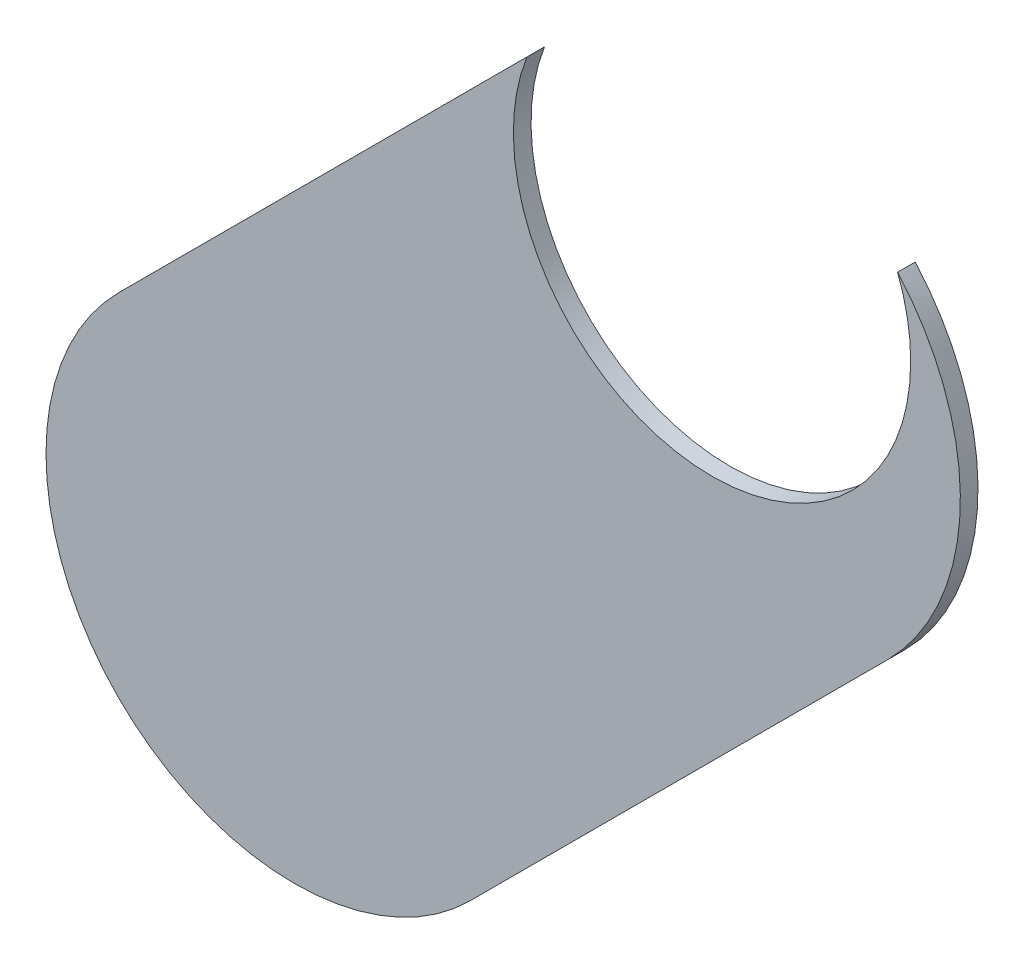
ISO-10303-21;
HEADER;
FILE_DESCRIPTION(('STEP AP214'),'2;1');
FILE_NAME('part.step','',(''),(''),'','','');
FILE_SCHEMA(('AUTOMOTIVE_DESIGN { 1 0 10303 214 1 1 1 1 }'));
ENDSEC;
DATA;
#1=APPLICATION_CONTEXT('core data for automotive mechanical design processes');
#2=APPLICATION_PROTOCOL_DEFINITION('international standard','automotive_design',2000,#1);
#3=PRODUCT_CONTEXT('',#1,'mechanical');
#4=PRODUCT('Part','Part','',(#3));
#5=PRODUCT_RELATED_PRODUCT_CATEGORY('part','',(#4));
#6=PRODUCT_DEFINITION_FORMATION('','',#4);
#7=PRODUCT_DEFINITION_CONTEXT('part definition',#1,'design');
#8=PRODUCT_DEFINITION('design','',#6,#7);
#9=PRODUCT_DEFINITION_SHAPE('','',#8);
#10=(LENGTH_UNIT() NAMED_UNIT(*) SI_UNIT(.MILLI.,.METRE.));
#11=(NAMED_UNIT(*) PLANE_ANGLE_UNIT() SI_UNIT($,.RADIAN.));
#12=(NAMED_UNIT(*) SI_UNIT($,.STERADIAN.) SOLID_ANGLE_UNIT());
#13=UNCERTAINTY_MEASURE_WITH_UNIT(LENGTH_MEASURE(1.E-05),#10,'distance_accuracy_value','');
#14=(GEOMETRIC_REPRESENTATION_CONTEXT(3) GLOBAL_UNCERTAINTY_ASSIGNED_CONTEXT((#13)) GLOBAL_UNIT_ASSIGNED_CONTEXT((#10,
#11,#12)) REPRESENTATION_CONTEXT('',''));
#15=CARTESIAN_POINT('',(0.,0.,0.));
#16=DIRECTION('',(0.,0.,1.));
#17=DIRECTION('',(1.,0.,0.));
#18=AXIS2_PLACEMENT_3D('',#15,#16,#17);
#19=CARTESIAN_POINT('',(56.93250996,61.21601168,0.));
#20=DIRECTION('',(-0.707106781186548,0.707106781186548,0.));
#21=DIRECTION('',(0.707106781186548,0.707106781186548,0.));
#22=AXIS2_PLACEMENT_3D('',#19,#20,#21);
#23=PLANE('',#22);
#24=DIRECTION('',(0.707106781186548,0.707106781186548,0.));
#25=VECTOR('',#24,1.);
#26=CARTESIAN_POINT('',(56.93250996,61.21601168,0.03556));
#27=LINE('',#26,#25);
#28=CARTESIAN_POINT('',(56.93250996,61.21601168,0.03556));
#29=VERTEX_POINT('',#28);
#30=CARTESIAN_POINT('',(57.77355476,62.05705648,0.03556));
#31=VERTEX_POINT('',#30);
#32=EDGE_CURVE('E11',#29,#31,#27,.T.);
#33=ORIENTED_EDGE('',*,*,#32,.F.);
#34=DIRECTION('',(0.,0.,1.));
#35=VECTOR('',#34,1.);
#36=CARTESIAN_POINT('',(56.93250996,61.21601168,0.));
#37=LINE('',#36,#35);
#38=CARTESIAN_POINT('',(56.93250996,61.21601168,0.));
#39=VERTEX_POINT('',#38);
#40=EDGE_CURVE('E24',#39,#29,#37,.T.);
#41=ORIENTED_EDGE('',*,*,#40,.F.);
#42=DIRECTION('',(0.707106781186548,0.707106781186548,0.));
#43=VECTOR('',#42,1.);
#44=CARTESIAN_POINT('',(56.93250996,61.21601168,0.));
#45=LINE('',#44,#43);
#46=CARTESIAN_POINT('',(57.77355476,62.05705648,0.));
#47=VERTEX_POINT('',#46);
#48=EDGE_CURVE('E88',#39,#47,#45,.T.);
#49=ORIENTED_EDGE('',*,*,#48,.T.);
#50=DIRECTION('',(0.,0.,1.));
#51=VECTOR('',#50,1.);
#52=CARTESIAN_POINT('',(57.77355476,62.05705648,0.));
#53=LINE('',#52,#51);
#54=EDGE_CURVE('E37',#47,#31,#53,.T.);
#55=ORIENTED_EDGE('',*,*,#54,.T.);
#56=EDGE_LOOP('',(#33,#41,#49,#55));
#57=FACE_BOUND('',#56,.T.);
#58=ADVANCED_FACE('F17',(#57),#23,.F.);
#59=CARTESIAN_POINT('',(57.420002,62.41060924,0.));
#60=DIRECTION('',(0.,0.,-1.));
#61=DIRECTION('',(0.70710678118654,-0.707106781186555,0.));
#62=AXIS2_PLACEMENT_3D('',#59,#60,#61);
#63=CYLINDRICAL_SURFACE('',#62,0.499999108206441);
#64=CARTESIAN_POINT('',(57.420002,62.41060924,0.03556));
#65=DIRECTION('',(0.,0.,1.));
#66=DIRECTION('',(0.70710678118654,-0.707106781186555,0.));
#67=AXIS2_PLACEMENT_3D('',#64,#65,#66);
#68=CIRCLE('',#67,0.499999108206441);
#69=CARTESIAN_POINT('',(57.7936198745913,62.7428874246483,0.03556));
#70=VERTEX_POINT('',#69);
#71=EDGE_CURVE('E111',#31,#70,#68,.T.);
#72=ORIENTED_EDGE('',*,*,#71,.F.);
#73=ORIENTED_EDGE('',*,*,#54,.F.);
#74=CARTESIAN_POINT('',(57.420002,62.41060924,0.));
#75=DIRECTION('',(0.,0.,1.));
#76=DIRECTION('',(0.70710678118654,-0.707106781186555,0.));
#77=AXIS2_PLACEMENT_3D('',#74,#75,#76);
#78=CIRCLE('',#77,0.499999108206441);
#79=CARTESIAN_POINT('',(57.7936198745913,62.7428874246483,0.));
#80=VERTEX_POINT('',#79);
#81=EDGE_CURVE('E108',#47,#80,#78,.T.);
#82=ORIENTED_EDGE('',*,*,#81,.T.);
#83=DIRECTION('',(0.,0.,1.));
#84=VECTOR('',#83,1.);
#85=CARTESIAN_POINT('',(57.7936198745913,62.7428874246483,0.));
#86=LINE('',#85,#84);
#87=EDGE_CURVE('E106',#80,#70,#86,.T.);
#88=ORIENTED_EDGE('',*,*,#87,.T.);
#89=EDGE_LOOP('',(#72,#73,#82,#88));
#90=FACE_BOUND('',#89,.T.);
#91=ADVANCED_FACE('F118',(#90),#63,.T.);
#92=CARTESIAN_POINT('',(57.420002,62.6000272,0.));
#93=DIRECTION('',(0.,0.,-1.));
#94=DIRECTION('',(1.,0.,0.));
#95=AXIS2_PLACEMENT_3D('',#92,#93,#94);
#96=CYLINDRICAL_SURFACE('',#95,0.3999992);
#97=DIRECTION('',(0.,0.,1.));
#98=VECTOR('',#97,1.);
#99=CARTESIAN_POINT('',(57.8200012,62.6000272,0.));
#100=LINE('',#99,#98);
#101=CARTESIAN_POINT('',(57.8200012,62.6000272,0.));
#102=VERTEX_POINT('',#101);
#103=CARTESIAN_POINT('',(57.8200012,62.6000272,0.03556));
#104=VERTEX_POINT('',#103);
#105=EDGE_CURVE('E104',#102,#104,#100,.T.);
#106=ORIENTED_EDGE('',*,*,#105,.T.);
#107=CARTESIAN_POINT('',(57.420002,62.6000272,0.03556));
#108=DIRECTION('',(0.,0.,1.));
#109=DIRECTION('',(1.,0.,0.));
#110=AXIS2_PLACEMENT_3D('',#107,#108,#109);
#111=CIRCLE('',#110,0.3999992);
#112=EDGE_CURVE('E101',#104,#70,#111,.T.);
#113=ORIENTED_EDGE('',*,*,#112,.T.);
#114=ORIENTED_EDGE('',*,*,#87,.F.);
#115=CARTESIAN_POINT('',(57.420002,62.6000272,0.));
#116=DIRECTION('',(0.,0.,1.));
#117=DIRECTION('',(1.,0.,0.));
#118=AXIS2_PLACEMENT_3D('',#115,#116,#117);
#119=CIRCLE('',#118,0.3999992);
#120=EDGE_CURVE('E98',#102,#80,#119,.T.);
#121=ORIENTED_EDGE('',*,*,#120,.F.);
#122=EDGE_LOOP('',(#106,#113,#114,#121));
#123=FACE_BOUND('',#122,.T.);
#124=ADVANCED_FACE('F124',(#123),#96,.F.);
#125=CARTESIAN_POINT('',(57.420002,62.6000272,0.));
#126=DIRECTION('',(0.,0.,-1.));
#127=DIRECTION('',(1.,0.,0.));
#128=AXIS2_PLACEMENT_3D('',#125,#126,#127);
#129=CYLINDRICAL_SURFACE('',#128,0.3999992);
#130=DIRECTION('',(0.,0.,1.));
#131=VECTOR('',#130,1.);
#132=CARTESIAN_POINT('',(57.0471425300462,62.7448552900462,0.));
#133=LINE('',#132,#131);
#134=CARTESIAN_POINT('',(57.0471425300462,62.7448552900462,0.));
#135=VERTEX_POINT('',#134);
#136=CARTESIAN_POINT('',(57.0471425300462,62.7448552900462,0.03556));
#137=VERTEX_POINT('',#136);
#138=EDGE_CURVE('E79',#135,#137,#133,.T.);
#139=ORIENTED_EDGE('',*,*,#138,.T.);
#140=CARTESIAN_POINT('',(57.420002,62.6000272,0.03556));
#141=DIRECTION('',(0.,0.,1.));
#142=DIRECTION('',(1.,0.,0.));
#143=AXIS2_PLACEMENT_3D('',#140,#141,#142);
#144=CIRCLE('',#143,0.3999992);
#145=EDGE_CURVE('E94',#137,#104,#144,.T.);
#146=ORIENTED_EDGE('',*,*,#145,.T.);
#147=ORIENTED_EDGE('',*,*,#105,.F.);
#148=EDGE_CURVE('E93',#135,#102,#119,.T.);
#149=ORIENTED_EDGE('',*,*,#148,.F.);
#150=EDGE_LOOP('',(#139,#146,#147,#149));
#151=FACE_BOUND('',#150,.T.);
#152=ADVANCED_FACE('F126',(#151),#129,.F.);
#153=CARTESIAN_POINT('',(57.0471425300462,62.7448552900462,0.));
#154=DIRECTION('',(0.707106781186548,-0.707106781186548,0.));
#155=DIRECTION('',(-0.707106781186548,-0.707106781186548,0.));
#156=AXIS2_PLACEMENT_3D('',#153,#154,#155);
#157=PLANE('',#156);
#158=DIRECTION('',(-0.707106781186548,-0.707106781186548,0.));
#159=VECTOR('',#158,1.);
#160=CARTESIAN_POINT('',(57.06644924,62.764162,0.03556));
#161=LINE('',#160,#159);
#162=CARTESIAN_POINT('',(56.22540444,61.9231172,0.03556));
#163=VERTEX_POINT('',#162);
#164=EDGE_CURVE('E83',#137,#163,#161,.T.);
#165=ORIENTED_EDGE('',*,*,#164,.F.);
#166=ORIENTED_EDGE('',*,*,#138,.F.);
#167=DIRECTION('',(-0.707106781186548,-0.707106781186548,0.));
#168=VECTOR('',#167,1.);
#169=CARTESIAN_POINT('',(57.06644924,62.764162,0.));
#170=LINE('',#169,#168);
#171=CARTESIAN_POINT('',(56.22540444,61.9231172,0.));
#172=VERTEX_POINT('',#171);
#173=EDGE_CURVE('E75',#135,#172,#170,.T.);
#174=ORIENTED_EDGE('',*,*,#173,.T.);
#175=DIRECTION('',(0.,0.,1.));
#176=VECTOR('',#175,1.);
#177=CARTESIAN_POINT('',(56.22540444,61.9231172,0.));
#178=LINE('',#177,#176);
#179=EDGE_CURVE('E65',#172,#163,#178,.T.);
#180=ORIENTED_EDGE('',*,*,#179,.T.);
#181=EDGE_LOOP('',(#165,#166,#174,#180));
#182=FACE_BOUND('',#181,.T.);
#183=ADVANCED_FACE('F78',(#182),#157,.F.);
#184=CARTESIAN_POINT('',(56.5789572,61.56956444,0.));
#185=DIRECTION('',(0.,0.,-1.));
#186=DIRECTION('',(-0.70710678118654,0.707106781186555,0.));
#187=AXIS2_PLACEMENT_3D('',#184,#185,#186);
#188=CYLINDRICAL_SURFACE('',#187,0.499999108206441);
#189=CARTESIAN_POINT('',(56.5789572,61.56956444,0.03556));
#190=DIRECTION('',(0.,0.,1.));
#191=DIRECTION('',(-0.70710678118654,0.707106781186555,0.));
#192=AXIS2_PLACEMENT_3D('',#189,#190,#191);
#193=CIRCLE('',#192,0.499999108206441);
#194=EDGE_CURVE('E71',#163,#29,#193,.T.);
#195=ORIENTED_EDGE('',*,*,#194,.F.);
#196=ORIENTED_EDGE('',*,*,#179,.F.);
#197=CARTESIAN_POINT('',(56.5789572,61.56956444,0.));
#198=DIRECTION('',(0.,0.,1.));
#199=DIRECTION('',(-0.70710678118654,0.707106781186555,0.));
#200=AXIS2_PLACEMENT_3D('',#197,#198,#199);
#201=CIRCLE('',#200,0.499999108206441);
#202=EDGE_CURVE('E69',#172,#39,#201,.T.);
#203=ORIENTED_EDGE('',*,*,#202,.T.);
#204=ORIENTED_EDGE('',*,*,#40,.T.);
#205=EDGE_LOOP('',(#195,#196,#203,#204));
#206=FACE_BOUND('',#205,.T.);
#207=ADVANCED_FACE('F67',(#206),#188,.T.);
#208=CARTESIAN_POINT('',(56.93250996,61.21601168,0.));
#209=DIRECTION('',(0.,0.,-1.));
#210=DIRECTION('',(-1.,0.,0.));
#211=AXIS2_PLACEMENT_3D('',#208,#209,#210);
#212=PLANE('',#211);
#213=ORIENTED_EDGE('',*,*,#48,.F.);
#214=ORIENTED_EDGE('',*,*,#202,.F.);
#215=ORIENTED_EDGE('',*,*,#173,.F.);
#216=ORIENTED_EDGE('',*,*,#148,.T.);
#217=ORIENTED_EDGE('',*,*,#120,.T.);
#218=ORIENTED_EDGE('',*,*,#81,.F.);
#219=EDGE_LOOP('',(#213,#214,#215,#216,#217,#218));
#220=FACE_BOUND('',#219,.T.);
#221=ADVANCED_FACE('F86',(#220),#212,.T.);
#222=CARTESIAN_POINT('',(56.93250996,61.21601168,0.03556));
#223=DIRECTION('',(0.,0.,-1.));
#224=DIRECTION('',(-1.,0.,0.));
#225=AXIS2_PLACEMENT_3D('',#222,#223,#224);
#226=PLANE('',#225);
#227=ORIENTED_EDGE('',*,*,#194,.T.);
#228=ORIENTED_EDGE('',*,*,#32,.T.);
#229=ORIENTED_EDGE('',*,*,#71,.T.);
#230=ORIENTED_EDGE('',*,*,#112,.F.);
#231=ORIENTED_EDGE('',*,*,#145,.F.);
#232=ORIENTED_EDGE('',*,*,#164,.T.);
#233=EDGE_LOOP('',(#227,#228,#229,#230,#231,#232));
#234=FACE_BOUND('',#233,.T.);
#235=ADVANCED_FACE('F121',(#234),#226,.F.);
#236=CLOSED_SHELL('',(#58,#91,#124,#152,#183,#207,#221,#235));
#237=MANIFOLD_SOLID_BREP('B1',#236);
#238=ADVANCED_BREP_SHAPE_REPRESENTATION('',(#18,#237),#14);
#239=SHAPE_DEFINITION_REPRESENTATION(#9,#238);
ENDSEC;
END-ISO-10303-21;
